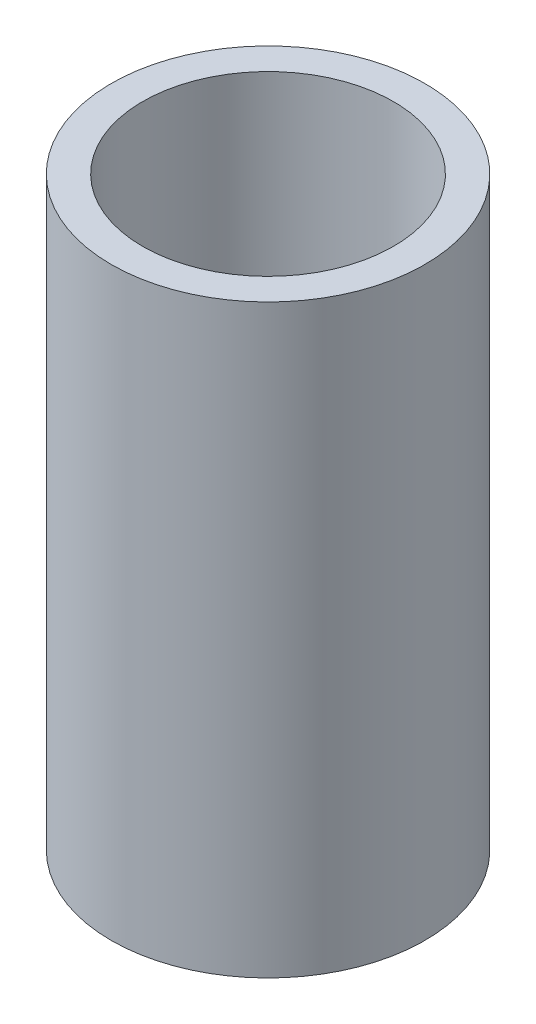
ISO-10303-21;
HEADER;
FILE_DESCRIPTION(('STEP AP214'),'2;1');
FILE_NAME('part.step','',(''),(''),'','','');
FILE_SCHEMA(('AUTOMOTIVE_DESIGN { 1 0 10303 214 1 1 1 1 }'));
ENDSEC;
DATA;
#1=APPLICATION_CONTEXT('core data for automotive mechanical design processes');
#2=APPLICATION_PROTOCOL_DEFINITION('international standard','automotive_design',2000,#1);
#3=PRODUCT_CONTEXT('',#1,'mechanical');
#4=PRODUCT('Part','Part','',(#3));
#5=PRODUCT_RELATED_PRODUCT_CATEGORY('part','',(#4));
#6=PRODUCT_DEFINITION_FORMATION('','',#4);
#7=PRODUCT_DEFINITION_CONTEXT('part definition',#1,'design');
#8=PRODUCT_DEFINITION('design','',#6,#7);
#9=PRODUCT_DEFINITION_SHAPE('','',#8);
#10=(LENGTH_UNIT() NAMED_UNIT(*) SI_UNIT(.MILLI.,.METRE.));
#11=(NAMED_UNIT(*) PLANE_ANGLE_UNIT() SI_UNIT($,.RADIAN.));
#12=(NAMED_UNIT(*) SI_UNIT($,.STERADIAN.) SOLID_ANGLE_UNIT());
#13=UNCERTAINTY_MEASURE_WITH_UNIT(LENGTH_MEASURE(1.E-05),#10,'distance_accuracy_value','');
#14=(GEOMETRIC_REPRESENTATION_CONTEXT(3) GLOBAL_UNCERTAINTY_ASSIGNED_CONTEXT((#13)) GLOBAL_UNIT_ASSIGNED_CONTEXT((#10,
#11,#12)) REPRESENTATION_CONTEXT('',''));
#15=CARTESIAN_POINT('',(0.,0.,0.));
#16=DIRECTION('',(0.,0.,1.));
#17=DIRECTION('',(1.,0.,0.));
#18=AXIS2_PLACEMENT_3D('',#15,#16,#17);
#19=CARTESIAN_POINT('',(0.,14.,0.));
#20=DIRECTION('',(0.,1.,0.));
#21=DIRECTION('',(0.,0.,1.));
#22=AXIS2_PLACEMENT_3D('',#19,#20,#21);
#23=PLANE('',#22);
#24=CARTESIAN_POINT('',(0.,14.,0.));
#25=DIRECTION('',(0.,1.,0.));
#26=DIRECTION('',(0.,0.,1.));
#27=AXIS2_PLACEMENT_3D('',#24,#25,#26);
#28=CIRCLE('',#27,7.5);
#29=CARTESIAN_POINT('',(0.,14.,7.5));
#30=VERTEX_POINT('',#29);
#31=EDGE_CURVE('E10',#30,#30,#28,.T.);
#32=ORIENTED_EDGE('',*,*,#31,.T.);
#33=EDGE_LOOP('',(#32));
#34=FACE_BOUND('',#33,.T.);
#35=CARTESIAN_POINT('',(0.,14.,0.));
#36=DIRECTION('',(0.,1.,0.));
#37=DIRECTION('',(0.,0.,1.));
#38=AXIS2_PLACEMENT_3D('',#35,#36,#37);
#39=CIRCLE('',#38,6.);
#40=CARTESIAN_POINT('',(0.,14.,6.));
#41=VERTEX_POINT('',#40);
#42=EDGE_CURVE('E58',#41,#41,#39,.T.);
#43=ORIENTED_EDGE('',*,*,#42,.F.);
#44=EDGE_LOOP('',(#43));
#45=FACE_BOUND('',#44,.T.);
#46=ADVANCED_FACE('F45',(#34,#45),#23,.T.);
#47=CARTESIAN_POINT('',(0.,-14.,0.));
#48=DIRECTION('',(0.,1.,0.));
#49=DIRECTION('',(0.,0.,1.));
#50=AXIS2_PLACEMENT_3D('',#47,#48,#49);
#51=PLANE('',#50);
#52=CARTESIAN_POINT('',(0.,-14.,0.));
#53=DIRECTION('',(0.,1.,0.));
#54=DIRECTION('',(0.,0.,1.));
#55=AXIS2_PLACEMENT_3D('',#52,#53,#54);
#56=CIRCLE('',#55,7.5);
#57=CARTESIAN_POINT('',(0.,-14.,7.5));
#58=VERTEX_POINT('',#57);
#59=EDGE_CURVE('E49',#58,#58,#56,.T.);
#60=ORIENTED_EDGE('',*,*,#59,.F.);
#61=EDGE_LOOP('',(#60));
#62=FACE_BOUND('',#61,.T.);
#63=CARTESIAN_POINT('',(0.,-14.,0.));
#64=DIRECTION('',(0.,1.,0.));
#65=DIRECTION('',(0.,0.,1.));
#66=AXIS2_PLACEMENT_3D('',#63,#64,#65);
#67=CIRCLE('',#66,6.);
#68=CARTESIAN_POINT('',(0.,-14.,6.));
#69=VERTEX_POINT('',#68);
#70=EDGE_CURVE('E60',#69,#69,#67,.T.);
#71=ORIENTED_EDGE('',*,*,#70,.T.);
#72=EDGE_LOOP('',(#71));
#73=FACE_BOUND('',#72,.T.);
#74=ADVANCED_FACE('F72',(#62,#73),#51,.F.);
#75=CARTESIAN_POINT('',(0.,14.,0.));
#76=DIRECTION('',(0.,-1.,0.));
#77=DIRECTION('',(0.,0.,-1.));
#78=AXIS2_PLACEMENT_3D('',#75,#76,#77);
#79=CYLINDRICAL_SURFACE('',#78,7.5);
#80=ORIENTED_EDGE('',*,*,#31,.F.);
#81=EDGE_LOOP('',(#80));
#82=FACE_BOUND('',#81,.T.);
#83=ORIENTED_EDGE('',*,*,#59,.T.);
#84=EDGE_LOOP('',(#83));
#85=FACE_BOUND('',#84,.T.);
#86=ADVANCED_FACE('F47',(#82,#85),#79,.T.);
#87=CARTESIAN_POINT('',(0.,14.,0.));
#88=DIRECTION('',(0.,-1.,0.));
#89=DIRECTION('',(0.,0.,-1.));
#90=AXIS2_PLACEMENT_3D('',#87,#88,#89);
#91=CYLINDRICAL_SURFACE('',#90,6.);
#92=ORIENTED_EDGE('',*,*,#42,.T.);
#93=EDGE_LOOP('',(#92));
#94=FACE_BOUND('',#93,.T.);
#95=ORIENTED_EDGE('',*,*,#70,.F.);
#96=EDGE_LOOP('',(#95));
#97=FACE_BOUND('',#96,.T.);
#98=ADVANCED_FACE('F68',(#94,#97),#91,.F.);
#99=CLOSED_SHELL('',(#46,#74,#86,#98));
#100=MANIFOLD_SOLID_BREP('B2',#99);
#101=ADVANCED_BREP_SHAPE_REPRESENTATION('',(#18,#100),#14);
#102=SHAPE_DEFINITION_REPRESENTATION(#9,#101);
ENDSEC;
END-ISO-10303-21;
